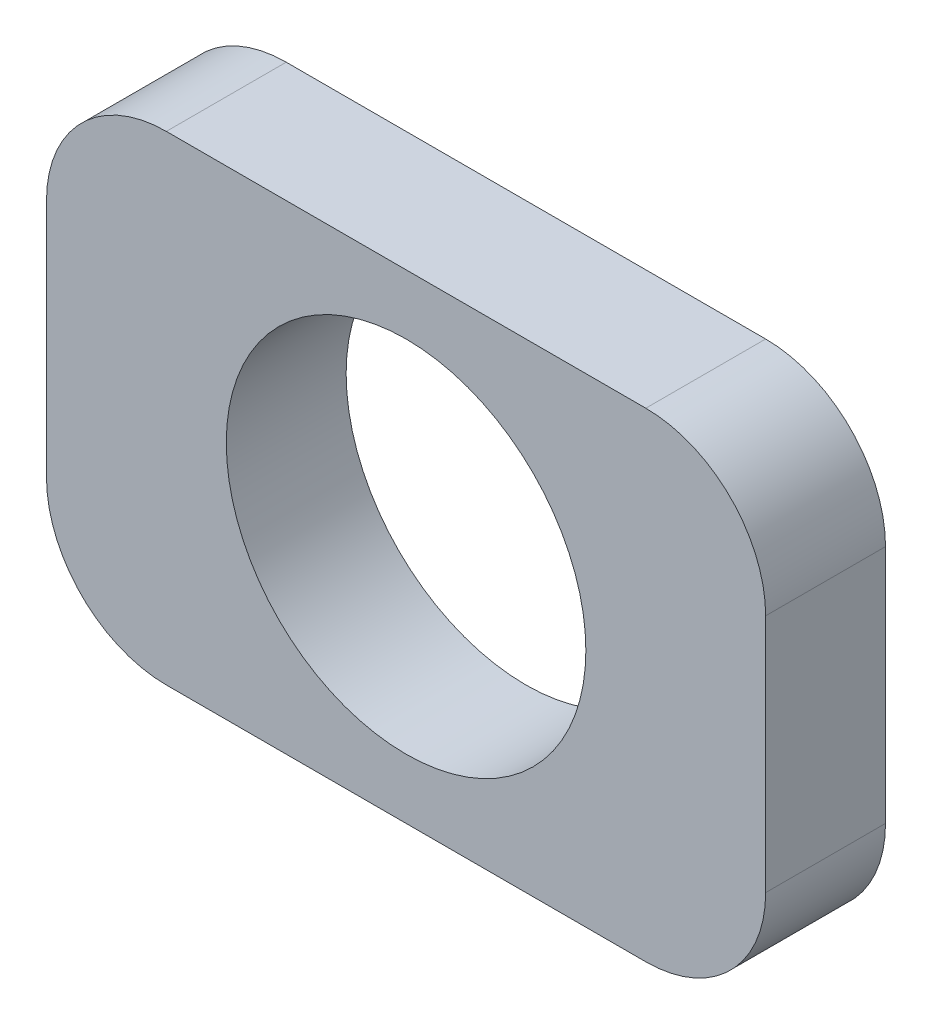
ISO-10303-21;
HEADER;
FILE_DESCRIPTION(('STEP AP214'),'2;1');
FILE_NAME('part.step','',(''),(''),'','','');
FILE_SCHEMA(('AUTOMOTIVE_DESIGN { 1 0 10303 214 1 1 1 1 }'));
ENDSEC;
DATA;
#1=APPLICATION_CONTEXT('core data for automotive mechanical design processes');
#2=APPLICATION_PROTOCOL_DEFINITION('international standard','automotive_design',2000,#1);
#3=PRODUCT_CONTEXT('',#1,'mechanical');
#4=PRODUCT('Part','Part','',(#3));
#5=PRODUCT_RELATED_PRODUCT_CATEGORY('part','',(#4));
#6=PRODUCT_DEFINITION_FORMATION('','',#4);
#7=PRODUCT_DEFINITION_CONTEXT('part definition',#1,'design');
#8=PRODUCT_DEFINITION('design','',#6,#7);
#9=PRODUCT_DEFINITION_SHAPE('','',#8);
#10=(LENGTH_UNIT() NAMED_UNIT(*) SI_UNIT(.MILLI.,.METRE.));
#11=(NAMED_UNIT(*) PLANE_ANGLE_UNIT() SI_UNIT($,.RADIAN.));
#12=(NAMED_UNIT(*) SI_UNIT($,.STERADIAN.) SOLID_ANGLE_UNIT());
#13=UNCERTAINTY_MEASURE_WITH_UNIT(LENGTH_MEASURE(1.E-05),#10,'distance_accuracy_value','');
#14=(GEOMETRIC_REPRESENTATION_CONTEXT(3) GLOBAL_UNCERTAINTY_ASSIGNED_CONTEXT((#13)) GLOBAL_UNIT_ASSIGNED_CONTEXT((#10,
#11,#12)) REPRESENTATION_CONTEXT('',''));
#15=CARTESIAN_POINT('',(0.,0.,0.));
#16=DIRECTION('',(0.,0.,1.));
#17=DIRECTION('',(1.,0.,0.));
#18=AXIS2_PLACEMENT_3D('',#15,#16,#17);
#19=CARTESIAN_POINT('',(10.,10.,10.));
#20=DIRECTION('',(0.,0.,-1.));
#21=DIRECTION('',(-1.,0.,0.));
#22=AXIS2_PLACEMENT_3D('',#19,#20,#21);
#23=PLANE('',#22);
#24=CARTESIAN_POINT('',(10.,10.,10.));
#25=DIRECTION('',(0.,0.,1.));
#26=DIRECTION('',(-1.,0.,0.));
#27=AXIS2_PLACEMENT_3D('',#24,#25,#26);
#28=CIRCLE('',#27,10.);
#29=CARTESIAN_POINT('',(0.,10.0000000000001,10.));
#30=VERTEX_POINT('',#29);
#31=CARTESIAN_POINT('',(10.0000000000001,0.,10.));
#32=VERTEX_POINT('',#31);
#33=EDGE_CURVE('E177',#30,#32,#28,.T.);
#34=ORIENTED_EDGE('',*,*,#33,.T.);
#35=DIRECTION('',(1.,0.,0.));
#36=VECTOR('',#35,1.);
#37=CARTESIAN_POINT('',(10.0000000000001,0.,10.));
#38=LINE('',#37,#36);
#39=CARTESIAN_POINT('',(49.9999999999999,0.,10.));
#40=VERTEX_POINT('',#39);
#41=EDGE_CURVE('E113',#32,#40,#38,.T.);
#42=ORIENTED_EDGE('',*,*,#41,.T.);
#43=CARTESIAN_POINT('',(50.,10.,10.));
#44=DIRECTION('',(0.,0.,1.));
#45=DIRECTION('',(1.,0.,0.));
#46=AXIS2_PLACEMENT_3D('',#43,#44,#45);
#47=CIRCLE('',#46,10.);
#48=CARTESIAN_POINT('',(60.,10.,10.));
#49=VERTEX_POINT('',#48);
#50=EDGE_CURVE('E198',#40,#49,#47,.T.);
#51=ORIENTED_EDGE('',*,*,#50,.T.);
#52=DIRECTION('',(0.,1.,0.));
#53=VECTOR('',#52,1.);
#54=CARTESIAN_POINT('',(60.,10.0000000000001,10.));
#55=LINE('',#54,#53);
#56=CARTESIAN_POINT('',(60.,29.9999999999999,10.));
#57=VERTEX_POINT('',#56);
#58=EDGE_CURVE('E212',#49,#57,#55,.T.);
#59=ORIENTED_EDGE('',*,*,#58,.T.);
#60=CARTESIAN_POINT('',(50.,30.,10.));
#61=DIRECTION('',(0.,0.,1.));
#62=DIRECTION('',(-1.,0.,0.));
#63=AXIS2_PLACEMENT_3D('',#60,#61,#62);
#64=CIRCLE('',#63,10.);
#65=CARTESIAN_POINT('',(49.9999999999999,40.,10.));
#66=VERTEX_POINT('',#65);
#67=EDGE_CURVE('E132',#57,#66,#64,.T.);
#68=ORIENTED_EDGE('',*,*,#67,.T.);
#69=DIRECTION('',(-1.,0.,0.));
#70=VECTOR('',#69,1.);
#71=CARTESIAN_POINT('',(10.0000000000001,40.,10.));
#72=LINE('',#71,#70);
#73=CARTESIAN_POINT('',(10.0000000000001,40.,10.));
#74=VERTEX_POINT('',#73);
#75=EDGE_CURVE('E126',#66,#74,#72,.T.);
#76=ORIENTED_EDGE('',*,*,#75,.T.);
#77=CARTESIAN_POINT('',(10.,30.,10.));
#78=DIRECTION('',(0.,0.,1.));
#79=DIRECTION('',(-1.,0.,0.));
#80=AXIS2_PLACEMENT_3D('',#77,#78,#79);
#81=CIRCLE('',#80,10.);
#82=CARTESIAN_POINT('',(0.,29.9999999999999,10.));
#83=VERTEX_POINT('',#82);
#84=EDGE_CURVE('E130',#74,#83,#81,.T.);
#85=ORIENTED_EDGE('',*,*,#84,.T.);
#86=DIRECTION('',(0.,-1.,0.));
#87=VECTOR('',#86,1.);
#88=CARTESIAN_POINT('',(0.,10.0000000000001,10.));
#89=LINE('',#88,#87);
#90=EDGE_CURVE('E70',#83,#30,#89,.T.);
#91=ORIENTED_EDGE('',*,*,#90,.T.);
#92=EDGE_LOOP('',(#34,#42,#51,#59,#68,#76,#85,#91));
#93=FACE_BOUND('',#92,.T.);
#94=CARTESIAN_POINT('',(30.,20.,10.));
#95=DIRECTION('',(0.,0.,1.));
#96=DIRECTION('',(1.,0.,0.));
#97=AXIS2_PLACEMENT_3D('',#94,#95,#96);
#98=CIRCLE('',#97,15.);
#99=CARTESIAN_POINT('',(45.,20.,10.));
#100=VERTEX_POINT('',#99);
#101=EDGE_CURVE('E159',#100,#100,#98,.T.);
#102=ORIENTED_EDGE('',*,*,#101,.F.);
#103=EDGE_LOOP('',(#102));
#104=FACE_BOUND('',#103,.T.);
#105=ADVANCED_FACE('F52',(#93,#104),#23,.F.);
#106=CARTESIAN_POINT('',(10.,10.,0.));
#107=DIRECTION('',(0.,0.,-1.));
#108=DIRECTION('',(-1.,0.,0.));
#109=AXIS2_PLACEMENT_3D('',#106,#107,#108);
#110=PLANE('',#109);
#111=CARTESIAN_POINT('',(10.,10.,0.));
#112=DIRECTION('',(0.,0.,1.));
#113=DIRECTION('',(-1.,0.,0.));
#114=AXIS2_PLACEMENT_3D('',#111,#112,#113);
#115=CIRCLE('',#114,10.);
#116=CARTESIAN_POINT('',(0.,10.0000000000001,0.));
#117=VERTEX_POINT('',#116);
#118=CARTESIAN_POINT('',(10.0000000000001,0.,0.));
#119=VERTEX_POINT('',#118);
#120=EDGE_CURVE('E154',#117,#119,#115,.T.);
#121=ORIENTED_EDGE('',*,*,#120,.F.);
#122=DIRECTION('',(0.,-1.,0.));
#123=VECTOR('',#122,1.);
#124=CARTESIAN_POINT('',(0.,10.0000000000001,0.));
#125=LINE('',#124,#123);
#126=CARTESIAN_POINT('',(0.,29.9999999999999,0.));
#127=VERTEX_POINT('',#126);
#128=EDGE_CURVE('E105',#127,#117,#125,.T.);
#129=ORIENTED_EDGE('',*,*,#128,.F.);
#130=CARTESIAN_POINT('',(10.,30.,0.));
#131=DIRECTION('',(0.,0.,1.));
#132=DIRECTION('',(-1.,0.,0.));
#133=AXIS2_PLACEMENT_3D('',#130,#131,#132);
#134=CIRCLE('',#133,10.);
#135=CARTESIAN_POINT('',(10.0000000000001,40.,0.));
#136=VERTEX_POINT('',#135);
#137=EDGE_CURVE('E99',#136,#127,#134,.T.);
#138=ORIENTED_EDGE('',*,*,#137,.F.);
#139=DIRECTION('',(-1.,0.,0.));
#140=VECTOR('',#139,1.);
#141=CARTESIAN_POINT('',(10.0000000000001,40.,0.));
#142=LINE('',#141,#140);
#143=CARTESIAN_POINT('',(49.9999999999999,40.,0.));
#144=VERTEX_POINT('',#143);
#145=EDGE_CURVE('E141',#144,#136,#142,.T.);
#146=ORIENTED_EDGE('',*,*,#145,.F.);
#147=CARTESIAN_POINT('',(50.,30.,0.));
#148=DIRECTION('',(0.,0.,1.));
#149=DIRECTION('',(-1.,0.,0.));
#150=AXIS2_PLACEMENT_3D('',#147,#148,#149);
#151=CIRCLE('',#150,10.);
#152=CARTESIAN_POINT('',(60.,29.9999999999999,0.));
#153=VERTEX_POINT('',#152);
#154=EDGE_CURVE('E168',#153,#144,#151,.T.);
#155=ORIENTED_EDGE('',*,*,#154,.F.);
#156=DIRECTION('',(0.,1.,0.));
#157=VECTOR('',#156,1.);
#158=CARTESIAN_POINT('',(60.,10.0000000000001,0.));
#159=LINE('',#158,#157);
#160=CARTESIAN_POINT('',(60.,10.,0.));
#161=VERTEX_POINT('',#160);
#162=EDGE_CURVE('E165',#161,#153,#159,.T.);
#163=ORIENTED_EDGE('',*,*,#162,.F.);
#164=CARTESIAN_POINT('',(50.,10.,0.));
#165=DIRECTION('',(0.,0.,1.));
#166=DIRECTION('',(1.,0.,0.));
#167=AXIS2_PLACEMENT_3D('',#164,#165,#166);
#168=CIRCLE('',#167,10.);
#169=CARTESIAN_POINT('',(49.9999999999999,0.,0.));
#170=VERTEX_POINT('',#169);
#171=EDGE_CURVE('E162',#170,#161,#168,.T.);
#172=ORIENTED_EDGE('',*,*,#171,.F.);
#173=DIRECTION('',(1.,0.,0.));
#174=VECTOR('',#173,1.);
#175=CARTESIAN_POINT('',(10.0000000000001,0.,0.));
#176=LINE('',#175,#174);
#177=EDGE_CURVE('E158',#119,#170,#176,.T.);
#178=ORIENTED_EDGE('',*,*,#177,.F.);
#179=EDGE_LOOP('',(#121,#129,#138,#146,#155,#163,#172,#178));
#180=FACE_BOUND('',#179,.T.);
#181=CARTESIAN_POINT('',(30.,20.,0.));
#182=DIRECTION('',(0.,0.,1.));
#183=DIRECTION('',(1.,0.,0.));
#184=AXIS2_PLACEMENT_3D('',#181,#182,#183);
#185=CIRCLE('',#184,15.);
#186=CARTESIAN_POINT('',(45.,20.,0.));
#187=VERTEX_POINT('',#186);
#188=EDGE_CURVE('E222',#187,#187,#185,.T.);
#189=ORIENTED_EDGE('',*,*,#188,.T.);
#190=EDGE_LOOP('',(#189));
#191=FACE_BOUND('',#190,.T.);
#192=ADVANCED_FACE('F202',(#180,#191),#110,.T.);
#193=CARTESIAN_POINT('',(10.,10.,10.));
#194=DIRECTION('',(0.,0.,-1.));
#195=DIRECTION('',(-1.,0.,0.));
#196=AXIS2_PLACEMENT_3D('',#193,#194,#195);
#197=CYLINDRICAL_SURFACE('',#196,10.);
#198=ORIENTED_EDGE('',*,*,#120,.T.);
#199=DIRECTION('',(0.,0.,-1.));
#200=VECTOR('',#199,1.);
#201=CARTESIAN_POINT('',(10.0000000000001,0.,10.));
#202=LINE('',#201,#200);
#203=EDGE_CURVE('E13',#32,#119,#202,.T.);
#204=ORIENTED_EDGE('',*,*,#203,.F.);
#205=ORIENTED_EDGE('',*,*,#33,.F.);
#206=DIRECTION('',(0.,0.,-1.));
#207=VECTOR('',#206,1.);
#208=CARTESIAN_POINT('',(0.,10.0000000000001,10.));
#209=LINE('',#208,#207);
#210=EDGE_CURVE('E150',#30,#117,#209,.T.);
#211=ORIENTED_EDGE('',*,*,#210,.T.);
#212=EDGE_LOOP('',(#198,#204,#205,#211));
#213=FACE_BOUND('',#212,.T.);
#214=ADVANCED_FACE('F54',(#213),#197,.T.);
#215=CARTESIAN_POINT('',(10.0000000000001,0.,10.));
#216=DIRECTION('',(0.,1.,0.));
#217=DIRECTION('',(0.,0.,1.));
#218=AXIS2_PLACEMENT_3D('',#215,#216,#217);
#219=PLANE('',#218);
#220=ORIENTED_EDGE('',*,*,#177,.T.);
#221=DIRECTION('',(0.,0.,-1.));
#222=VECTOR('',#221,1.);
#223=CARTESIAN_POINT('',(49.9999999999999,0.,10.));
#224=LINE('',#223,#222);
#225=EDGE_CURVE('E62',#40,#170,#224,.T.);
#226=ORIENTED_EDGE('',*,*,#225,.F.);
#227=ORIENTED_EDGE('',*,*,#41,.F.);
#228=ORIENTED_EDGE('',*,*,#203,.T.);
#229=EDGE_LOOP('',(#220,#226,#227,#228));
#230=FACE_BOUND('',#229,.T.);
#231=ADVANCED_FACE('F252',(#230),#219,.F.);
#232=CARTESIAN_POINT('',(50.,10.,10.));
#233=DIRECTION('',(0.,0.,-1.));
#234=DIRECTION('',(-1.,0.,0.));
#235=AXIS2_PLACEMENT_3D('',#232,#233,#234);
#236=CYLINDRICAL_SURFACE('',#235,10.);
#237=ORIENTED_EDGE('',*,*,#171,.T.);
#238=DIRECTION('',(0.,0.,-1.));
#239=VECTOR('',#238,1.);
#240=CARTESIAN_POINT('',(60.,10.,10.));
#241=LINE('',#240,#239);
#242=EDGE_CURVE('E188',#49,#161,#241,.T.);
#243=ORIENTED_EDGE('',*,*,#242,.F.);
#244=ORIENTED_EDGE('',*,*,#50,.F.);
#245=ORIENTED_EDGE('',*,*,#225,.T.);
#246=EDGE_LOOP('',(#237,#243,#244,#245));
#247=FACE_BOUND('',#246,.T.);
#248=ADVANCED_FACE('F196',(#247),#236,.T.);
#249=CARTESIAN_POINT('',(60.,10.0000000000001,10.));
#250=DIRECTION('',(-1.,0.,0.));
#251=DIRECTION('',(0.,0.,1.));
#252=AXIS2_PLACEMENT_3D('',#249,#250,#251);
#253=PLANE('',#252);
#254=ORIENTED_EDGE('',*,*,#162,.T.);
#255=DIRECTION('',(0.,0.,-1.));
#256=VECTOR('',#255,1.);
#257=CARTESIAN_POINT('',(60.,29.9999999999999,10.));
#258=LINE('',#257,#256);
#259=EDGE_CURVE('E184',#57,#153,#258,.T.);
#260=ORIENTED_EDGE('',*,*,#259,.F.);
#261=ORIENTED_EDGE('',*,*,#58,.F.);
#262=ORIENTED_EDGE('',*,*,#242,.T.);
#263=EDGE_LOOP('',(#254,#260,#261,#262));
#264=FACE_BOUND('',#263,.T.);
#265=ADVANCED_FACE('F207',(#264),#253,.F.);
#266=CARTESIAN_POINT('',(50.,30.,10.));
#267=DIRECTION('',(0.,0.,-1.));
#268=DIRECTION('',(-1.,0.,0.));
#269=AXIS2_PLACEMENT_3D('',#266,#267,#268);
#270=CYLINDRICAL_SURFACE('',#269,10.);
#271=ORIENTED_EDGE('',*,*,#154,.T.);
#272=DIRECTION('',(0.,0.,-1.));
#273=VECTOR('',#272,1.);
#274=CARTESIAN_POINT('',(49.9999999999999,40.,10.));
#275=LINE('',#274,#273);
#276=EDGE_CURVE('E143',#66,#144,#275,.T.);
#277=ORIENTED_EDGE('',*,*,#276,.F.);
#278=ORIENTED_EDGE('',*,*,#67,.F.);
#279=ORIENTED_EDGE('',*,*,#259,.T.);
#280=EDGE_LOOP('',(#271,#277,#278,#279));
#281=FACE_BOUND('',#280,.T.);
#282=ADVANCED_FACE('F210',(#281),#270,.T.);
#283=CARTESIAN_POINT('',(10.0000000000001,40.,10.));
#284=DIRECTION('',(0.,-1.,0.));
#285=DIRECTION('',(0.,0.,-1.));
#286=AXIS2_PLACEMENT_3D('',#283,#284,#285);
#287=PLANE('',#286);
#288=ORIENTED_EDGE('',*,*,#145,.T.);
#289=DIRECTION('',(0.,0.,-1.));
#290=VECTOR('',#289,1.);
#291=CARTESIAN_POINT('',(10.0000000000001,40.,10.));
#292=LINE('',#291,#290);
#293=EDGE_CURVE('E138',#74,#136,#292,.T.);
#294=ORIENTED_EDGE('',*,*,#293,.F.);
#295=ORIENTED_EDGE('',*,*,#75,.F.);
#296=ORIENTED_EDGE('',*,*,#276,.T.);
#297=EDGE_LOOP('',(#288,#294,#295,#296));
#298=FACE_BOUND('',#297,.T.);
#299=ADVANCED_FACE('F139',(#298),#287,.F.);
#300=CARTESIAN_POINT('',(10.,30.,10.));
#301=DIRECTION('',(0.,0.,-1.));
#302=DIRECTION('',(-1.,0.,0.));
#303=AXIS2_PLACEMENT_3D('',#300,#301,#302);
#304=CYLINDRICAL_SURFACE('',#303,10.);
#305=ORIENTED_EDGE('',*,*,#137,.T.);
#306=DIRECTION('',(0.,0.,-1.));
#307=VECTOR('',#306,1.);
#308=CARTESIAN_POINT('',(0.,29.9999999999999,10.));
#309=LINE('',#308,#307);
#310=EDGE_CURVE('E144',#83,#127,#309,.T.);
#311=ORIENTED_EDGE('',*,*,#310,.F.);
#312=ORIENTED_EDGE('',*,*,#84,.F.);
#313=ORIENTED_EDGE('',*,*,#293,.T.);
#314=EDGE_LOOP('',(#305,#311,#312,#313));
#315=FACE_BOUND('',#314,.T.);
#316=ADVANCED_FACE('F146',(#315),#304,.T.);
#317=CARTESIAN_POINT('',(0.,10.0000000000001,10.));
#318=DIRECTION('',(1.,0.,0.));
#319=DIRECTION('',(0.,0.,-1.));
#320=AXIS2_PLACEMENT_3D('',#317,#318,#319);
#321=PLANE('',#320);
#322=ORIENTED_EDGE('',*,*,#128,.T.);
#323=ORIENTED_EDGE('',*,*,#210,.F.);
#324=ORIENTED_EDGE('',*,*,#90,.F.);
#325=ORIENTED_EDGE('',*,*,#310,.T.);
#326=EDGE_LOOP('',(#322,#323,#324,#325));
#327=FACE_BOUND('',#326,.T.);
#328=ADVANCED_FACE('F240',(#327),#321,.F.);
#329=CARTESIAN_POINT('',(30.,20.,10.));
#330=DIRECTION('',(0.,0.,-1.));
#331=DIRECTION('',(-1.,0.,0.));
#332=AXIS2_PLACEMENT_3D('',#329,#330,#331);
#333=CYLINDRICAL_SURFACE('',#332,15.);
#334=ORIENTED_EDGE('',*,*,#101,.T.);
#335=EDGE_LOOP('',(#334));
#336=FACE_BOUND('',#335,.T.);
#337=ORIENTED_EDGE('',*,*,#188,.F.);
#338=EDGE_LOOP('',(#337));
#339=FACE_BOUND('',#338,.T.);
#340=ADVANCED_FACE('F230',(#336,#339),#333,.F.);
#341=CLOSED_SHELL('',(#105,#192,#214,#231,#248,#265,#282,#299,#316,#328,#340));
#342=MANIFOLD_SOLID_BREP('B2',#341);
#343=ADVANCED_BREP_SHAPE_REPRESENTATION('',(#18,#342),#14);
#344=SHAPE_DEFINITION_REPRESENTATION(#9,#343);
ENDSEC;
END-ISO-10303-21;
